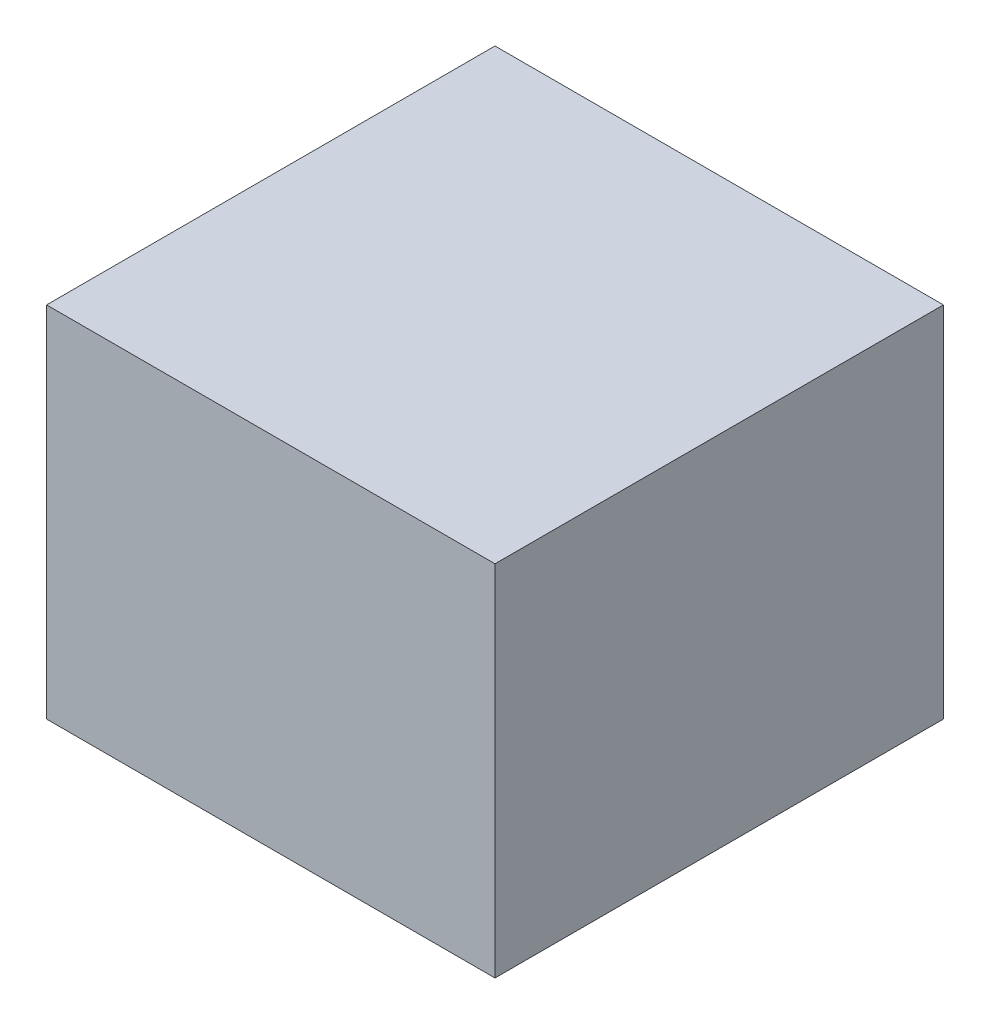
ISO-10303-21;
HEADER;
FILE_DESCRIPTION(('STEP AP214'),'2;1');
FILE_NAME('part.step','',(''),(''),'','','');
FILE_SCHEMA(('AUTOMOTIVE_DESIGN { 1 0 10303 214 1 1 1 1 }'));
ENDSEC;
DATA;
#1=APPLICATION_CONTEXT('core data for automotive mechanical design processes');
#2=APPLICATION_PROTOCOL_DEFINITION('international standard','automotive_design',2000,#1);
#3=PRODUCT_CONTEXT('',#1,'mechanical');
#4=PRODUCT('Part','Part','',(#3));
#5=PRODUCT_RELATED_PRODUCT_CATEGORY('part','',(#4));
#6=PRODUCT_DEFINITION_FORMATION('','',#4);
#7=PRODUCT_DEFINITION_CONTEXT('part definition',#1,'design');
#8=PRODUCT_DEFINITION('design','',#6,#7);
#9=PRODUCT_DEFINITION_SHAPE('','',#8);
#10=(LENGTH_UNIT() NAMED_UNIT(*) SI_UNIT(.MILLI.,.METRE.));
#11=(NAMED_UNIT(*) PLANE_ANGLE_UNIT() SI_UNIT($,.RADIAN.));
#12=(NAMED_UNIT(*) SI_UNIT($,.STERADIAN.) SOLID_ANGLE_UNIT());
#13=UNCERTAINTY_MEASURE_WITH_UNIT(LENGTH_MEASURE(1.E-05),#10,'distance_accuracy_value','');
#14=(GEOMETRIC_REPRESENTATION_CONTEXT(3) GLOBAL_UNCERTAINTY_ASSIGNED_CONTEXT((#13)) GLOBAL_UNIT_ASSIGNED_CONTEXT((#10,
#11,#12)) REPRESENTATION_CONTEXT('',''));
#15=CARTESIAN_POINT('',(0.,0.,0.));
#16=DIRECTION('',(0.,0.,1.));
#17=DIRECTION('',(1.,0.,0.));
#18=AXIS2_PLACEMENT_3D('',#15,#16,#17);
#19=CARTESIAN_POINT('',(-127.,203.2,-127.));
#20=DIRECTION('',(1.,0.,0.));
#21=DIRECTION('',(0.,0.,-1.));
#22=AXIS2_PLACEMENT_3D('',#19,#20,#21);
#23=PLANE('',#22);
#24=DIRECTION('',(0.,0.,1.));
#25=VECTOR('',#24,1.);
#26=CARTESIAN_POINT('',(-127.,0.,-127.));
#27=LINE('',#26,#25);
#28=CARTESIAN_POINT('',(-127.,0.,-127.));
#29=VERTEX_POINT('',#28);
#30=CARTESIAN_POINT('',(-127.,0.,127.));
#31=VERTEX_POINT('',#30);
#32=EDGE_CURVE('E96',#29,#31,#27,.T.);
#33=ORIENTED_EDGE('',*,*,#32,.T.);
#34=DIRECTION('',(0.,-1.,0.));
#35=VECTOR('',#34,1.);
#36=CARTESIAN_POINT('',(-127.,203.2,127.));
#37=LINE('',#36,#35);
#38=CARTESIAN_POINT('',(-127.,203.2,127.));
#39=VERTEX_POINT('',#38);
#40=EDGE_CURVE('E11',#39,#31,#37,.T.);
#41=ORIENTED_EDGE('',*,*,#40,.F.);
#42=DIRECTION('',(0.,0.,1.));
#43=VECTOR('',#42,1.);
#44=CARTESIAN_POINT('',(-127.,203.2,-127.));
#45=LINE('',#44,#43);
#46=CARTESIAN_POINT('',(-127.,203.2,-127.));
#47=VERTEX_POINT('',#46);
#48=EDGE_CURVE('E84',#47,#39,#45,.T.);
#49=ORIENTED_EDGE('',*,*,#48,.F.);
#50=DIRECTION('',(0.,-1.,0.));
#51=VECTOR('',#50,1.);
#52=CARTESIAN_POINT('',(-127.,203.2,-127.));
#53=LINE('',#52,#51);
#54=EDGE_CURVE('E92',#47,#29,#53,.T.);
#55=ORIENTED_EDGE('',*,*,#54,.T.);
#56=EDGE_LOOP('',(#33,#41,#49,#55));
#57=FACE_BOUND('',#56,.T.);
#58=ADVANCED_FACE('F33',(#57),#23,.F.);
#59=CARTESIAN_POINT('',(127.,203.2,127.));
#60=DIRECTION('',(0.,0.,-1.));
#61=DIRECTION('',(-1.,0.,0.));
#62=AXIS2_PLACEMENT_3D('',#59,#60,#61);
#63=PLANE('',#62);
#64=DIRECTION('',(1.,0.,0.));
#65=VECTOR('',#64,1.);
#66=CARTESIAN_POINT('',(127.,0.,127.));
#67=LINE('',#66,#65);
#68=CARTESIAN_POINT('',(127.,0.,127.));
#69=VERTEX_POINT('',#68);
#70=EDGE_CURVE('E88',#31,#69,#67,.T.);
#71=ORIENTED_EDGE('',*,*,#70,.T.);
#72=DIRECTION('',(0.,-1.,0.));
#73=VECTOR('',#72,1.);
#74=CARTESIAN_POINT('',(127.,203.2,127.));
#75=LINE('',#74,#73);
#76=CARTESIAN_POINT('',(127.,203.2,127.));
#77=VERTEX_POINT('',#76);
#78=EDGE_CURVE('E41',#77,#69,#75,.T.);
#79=ORIENTED_EDGE('',*,*,#78,.F.);
#80=DIRECTION('',(1.,0.,0.));
#81=VECTOR('',#80,1.);
#82=CARTESIAN_POINT('',(127.,203.2,127.));
#83=LINE('',#82,#81);
#84=EDGE_CURVE('E79',#39,#77,#83,.T.);
#85=ORIENTED_EDGE('',*,*,#84,.F.);
#86=ORIENTED_EDGE('',*,*,#40,.T.);
#87=EDGE_LOOP('',(#71,#79,#85,#86));
#88=FACE_BOUND('',#87,.T.);
#89=ADVANCED_FACE('F87',(#88),#63,.F.);
#90=CARTESIAN_POINT('',(127.,203.2,-127.));
#91=DIRECTION('',(-1.,0.,0.));
#92=DIRECTION('',(0.,0.,1.));
#93=AXIS2_PLACEMENT_3D('',#90,#91,#92);
#94=PLANE('',#93);
#95=DIRECTION('',(0.,0.,-1.));
#96=VECTOR('',#95,1.);
#97=CARTESIAN_POINT('',(127.,0.,-127.));
#98=LINE('',#97,#96);
#99=CARTESIAN_POINT('',(127.,0.,-127.));
#100=VERTEX_POINT('',#99);
#101=EDGE_CURVE('E66',#69,#100,#98,.T.);
#102=ORIENTED_EDGE('',*,*,#101,.T.);
#103=DIRECTION('',(0.,-1.,0.));
#104=VECTOR('',#103,1.);
#105=CARTESIAN_POINT('',(127.,203.2,-127.));
#106=LINE('',#105,#104);
#107=CARTESIAN_POINT('',(127.,203.2,-127.));
#108=VERTEX_POINT('',#107);
#109=EDGE_CURVE('E89',#108,#100,#106,.T.);
#110=ORIENTED_EDGE('',*,*,#109,.F.);
#111=DIRECTION('',(0.,0.,-1.));
#112=VECTOR('',#111,1.);
#113=CARTESIAN_POINT('',(127.,203.2,-127.));
#114=LINE('',#113,#112);
#115=EDGE_CURVE('E82',#77,#108,#114,.T.);
#116=ORIENTED_EDGE('',*,*,#115,.F.);
#117=ORIENTED_EDGE('',*,*,#78,.T.);
#118=EDGE_LOOP('',(#102,#110,#116,#117));
#119=FACE_BOUND('',#118,.T.);
#120=ADVANCED_FACE('F90',(#119),#94,.F.);
#121=CARTESIAN_POINT('',(127.,203.2,-127.));
#122=DIRECTION('',(0.,0.,1.));
#123=DIRECTION('',(1.,0.,0.));
#124=AXIS2_PLACEMENT_3D('',#121,#122,#123);
#125=PLANE('',#124);
#126=DIRECTION('',(-1.,0.,0.));
#127=VECTOR('',#126,1.);
#128=CARTESIAN_POINT('',(127.,0.,-127.));
#129=LINE('',#128,#127);
#130=EDGE_CURVE('E72',#100,#29,#129,.T.);
#131=ORIENTED_EDGE('',*,*,#130,.T.);
#132=ORIENTED_EDGE('',*,*,#54,.F.);
#133=DIRECTION('',(-1.,0.,0.));
#134=VECTOR('',#133,1.);
#135=CARTESIAN_POINT('',(127.,203.2,-127.));
#136=LINE('',#135,#134);
#137=EDGE_CURVE('E49',#108,#47,#136,.T.);
#138=ORIENTED_EDGE('',*,*,#137,.F.);
#139=ORIENTED_EDGE('',*,*,#109,.T.);
#140=EDGE_LOOP('',(#131,#132,#138,#139));
#141=FACE_BOUND('',#140,.T.);
#142=ADVANCED_FACE('F103',(#141),#125,.F.);
#143=CARTESIAN_POINT('',(0.,203.2,0.));
#144=DIRECTION('',(0.,-1.,0.));
#145=DIRECTION('',(0.,0.,-1.));
#146=AXIS2_PLACEMENT_3D('',#143,#144,#145);
#147=PLANE('',#146);
#148=ORIENTED_EDGE('',*,*,#48,.T.);
#149=ORIENTED_EDGE('',*,*,#84,.T.);
#150=ORIENTED_EDGE('',*,*,#115,.T.);
#151=ORIENTED_EDGE('',*,*,#137,.T.);
#152=EDGE_LOOP('',(#148,#149,#150,#151));
#153=FACE_BOUND('',#152,.T.);
#154=ADVANCED_FACE('F80',(#153),#147,.F.);
#155=CARTESIAN_POINT('',(0.,0.,0.));
#156=DIRECTION('',(0.,-1.,0.));
#157=DIRECTION('',(0.,0.,-1.));
#158=AXIS2_PLACEMENT_3D('',#155,#156,#157);
#159=PLANE('',#158);
#160=ORIENTED_EDGE('',*,*,#32,.F.);
#161=ORIENTED_EDGE('',*,*,#130,.F.);
#162=ORIENTED_EDGE('',*,*,#101,.F.);
#163=ORIENTED_EDGE('',*,*,#70,.F.);
#164=EDGE_LOOP('',(#160,#161,#162,#163));
#165=FACE_BOUND('',#164,.T.);
#166=ADVANCED_FACE('F106',(#165),#159,.T.);
#167=CLOSED_SHELL('',(#58,#89,#120,#142,#154,#166));
#168=MANIFOLD_SOLID_BREP('B2',#167);
#169=ADVANCED_BREP_SHAPE_REPRESENTATION('',(#18,#168),#14);
#170=SHAPE_DEFINITION_REPRESENTATION(#9,#169);
ENDSEC;
END-ISO-10303-21;
